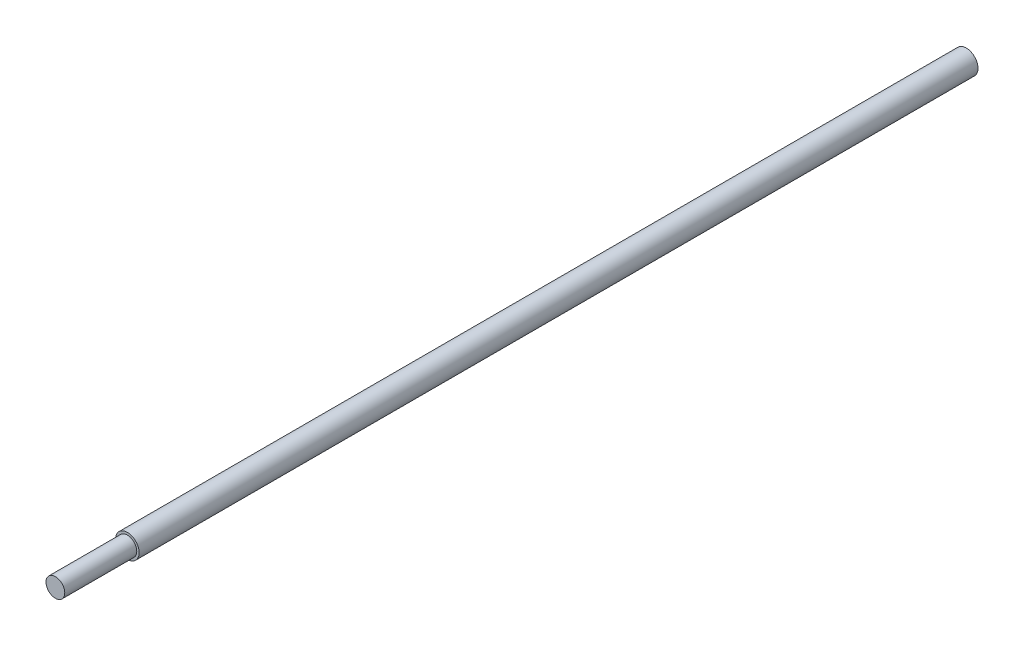
ISO-10303-21;
HEADER;
FILE_DESCRIPTION(('STEP AP214'),'2;1');
FILE_NAME('part.step','',(''),(''),'','','');
FILE_SCHEMA(('AUTOMOTIVE_DESIGN { 1 0 10303 214 1 1 1 1 }'));
ENDSEC;
DATA;
#1=APPLICATION_CONTEXT('core data for automotive mechanical design processes');
#2=APPLICATION_PROTOCOL_DEFINITION('international standard','automotive_design',2000,#1);
#3=PRODUCT_CONTEXT('',#1,'mechanical');
#4=PRODUCT('Part','Part','',(#3));
#5=PRODUCT_RELATED_PRODUCT_CATEGORY('part','',(#4));
#6=PRODUCT_DEFINITION_FORMATION('','',#4);
#7=PRODUCT_DEFINITION_CONTEXT('part definition',#1,'design');
#8=PRODUCT_DEFINITION('design','',#6,#7);
#9=PRODUCT_DEFINITION_SHAPE('','',#8);
#10=(LENGTH_UNIT() NAMED_UNIT(*) SI_UNIT(.MILLI.,.METRE.));
#11=(NAMED_UNIT(*) PLANE_ANGLE_UNIT() SI_UNIT($,.RADIAN.));
#12=(NAMED_UNIT(*) SI_UNIT($,.STERADIAN.) SOLID_ANGLE_UNIT());
#13=UNCERTAINTY_MEASURE_WITH_UNIT(LENGTH_MEASURE(1.E-05),#10,'distance_accuracy_value','');
#14=(GEOMETRIC_REPRESENTATION_CONTEXT(3) GLOBAL_UNCERTAINTY_ASSIGNED_CONTEXT((#13)) GLOBAL_UNIT_ASSIGNED_CONTEXT((#10,
#11,#12)) REPRESENTATION_CONTEXT('',''));
#15=CARTESIAN_POINT('',(0.,0.,0.));
#16=DIRECTION('',(0.,0.,1.));
#17=DIRECTION('',(1.,0.,0.));
#18=AXIS2_PLACEMENT_3D('',#15,#16,#17);
#19=CARTESIAN_POINT('',(0.,0.,536.));
#20=DIRECTION('',(0.,0.,1.));
#21=DIRECTION('',(1.,0.,0.));
#22=AXIS2_PLACEMENT_3D('',#19,#20,#21);
#23=PLANE('',#22);
#24=CARTESIAN_POINT('',(0.,0.,536.));
#25=DIRECTION('',(0.,0.,1.));
#26=DIRECTION('',(1.,0.,0.));
#27=AXIS2_PLACEMENT_3D('',#24,#25,#26);
#28=CIRCLE('',#27,7.5);
#29=CARTESIAN_POINT('',(7.5,0.,536.));
#30=VERTEX_POINT('',#29);
#31=EDGE_CURVE('E10',#30,#30,#28,.T.);
#32=ORIENTED_EDGE('',*,*,#31,.T.);
#33=EDGE_LOOP('',(#32));
#34=FACE_BOUND('',#33,.T.);
#35=CARTESIAN_POINT('',(0.,0.,536.));
#36=DIRECTION('',(0.,0.,1.));
#37=DIRECTION('',(1.,0.,0.));
#38=AXIS2_PLACEMENT_3D('',#35,#36,#37);
#39=CIRCLE('',#38,6.);
#40=CARTESIAN_POINT('',(6.,0.,536.));
#41=VERTEX_POINT('',#40);
#42=EDGE_CURVE('E43',#41,#41,#39,.T.);
#43=ORIENTED_EDGE('',*,*,#42,.F.);
#44=EDGE_LOOP('',(#43));
#45=FACE_BOUND('',#44,.T.);
#46=ADVANCED_FACE('F30',(#34,#45),#23,.T.);
#47=CARTESIAN_POINT('',(0.,0.,536.));
#48=DIRECTION('',(0.,0.,-1.));
#49=DIRECTION('',(-1.,0.,0.));
#50=AXIS2_PLACEMENT_3D('',#47,#48,#49);
#51=CYLINDRICAL_SURFACE('',#50,7.5);
#52=ORIENTED_EDGE('',*,*,#31,.F.);
#53=EDGE_LOOP('',(#52));
#54=FACE_BOUND('',#53,.T.);
#55=CARTESIAN_POINT('',(0.,0.,0.));
#56=DIRECTION('',(0.,0.,1.));
#57=DIRECTION('',(1.,0.,0.));
#58=AXIS2_PLACEMENT_3D('',#55,#56,#57);
#59=CIRCLE('',#58,7.5);
#60=CARTESIAN_POINT('',(7.5,0.,0.));
#61=VERTEX_POINT('',#60);
#62=EDGE_CURVE('E34',#61,#61,#59,.T.);
#63=ORIENTED_EDGE('',*,*,#62,.T.);
#64=EDGE_LOOP('',(#63));
#65=FACE_BOUND('',#64,.T.);
#66=ADVANCED_FACE('F32',(#54,#65),#51,.T.);
#67=CARTESIAN_POINT('',(0.,0.,0.));
#68=DIRECTION('',(0.,0.,1.));
#69=DIRECTION('',(1.,0.,0.));
#70=AXIS2_PLACEMENT_3D('',#67,#68,#69);
#71=PLANE('',#70);
#72=ORIENTED_EDGE('',*,*,#62,.F.);
#73=EDGE_LOOP('',(#72));
#74=FACE_BOUND('',#73,.T.);
#75=ADVANCED_FACE('F54',(#74),#71,.F.);
#76=CARTESIAN_POINT('',(0.,0.,582.));
#77=DIRECTION('',(0.,0.,-1.));
#78=DIRECTION('',(-1.,0.,0.));
#79=AXIS2_PLACEMENT_3D('',#76,#77,#78);
#80=CYLINDRICAL_SURFACE('',#79,6.);
#81=CARTESIAN_POINT('',(0.,0.,582.));
#82=DIRECTION('',(0.,0.,1.));
#83=DIRECTION('',(1.,0.,0.));
#84=AXIS2_PLACEMENT_3D('',#81,#82,#83);
#85=CIRCLE('',#84,6.);
#86=CARTESIAN_POINT('',(6.,0.,582.));
#87=VERTEX_POINT('',#86);
#88=EDGE_CURVE('E41',#87,#87,#85,.T.);
#89=ORIENTED_EDGE('',*,*,#88,.F.);
#90=EDGE_LOOP('',(#89));
#91=FACE_BOUND('',#90,.T.);
#92=ORIENTED_EDGE('',*,*,#42,.T.);
#93=EDGE_LOOP('',(#92));
#94=FACE_BOUND('',#93,.T.);
#95=ADVANCED_FACE('F51',(#91,#94),#80,.T.);
#96=CARTESIAN_POINT('',(0.,0.,582.));
#97=DIRECTION('',(0.,0.,1.));
#98=DIRECTION('',(1.,0.,0.));
#99=AXIS2_PLACEMENT_3D('',#96,#97,#98);
#100=PLANE('',#99);
#101=ORIENTED_EDGE('',*,*,#88,.T.);
#102=EDGE_LOOP('',(#101));
#103=FACE_BOUND('',#102,.T.);
#104=ADVANCED_FACE('F49',(#103),#100,.T.);
#105=CLOSED_SHELL('',(#46,#66,#75,#95,#104));
#106=MANIFOLD_SOLID_BREP('B2',#105);
#107=ADVANCED_BREP_SHAPE_REPRESENTATION('',(#18,#106),#14);
#108=SHAPE_DEFINITION_REPRESENTATION(#9,#107);
ENDSEC;
END-ISO-10303-21;
